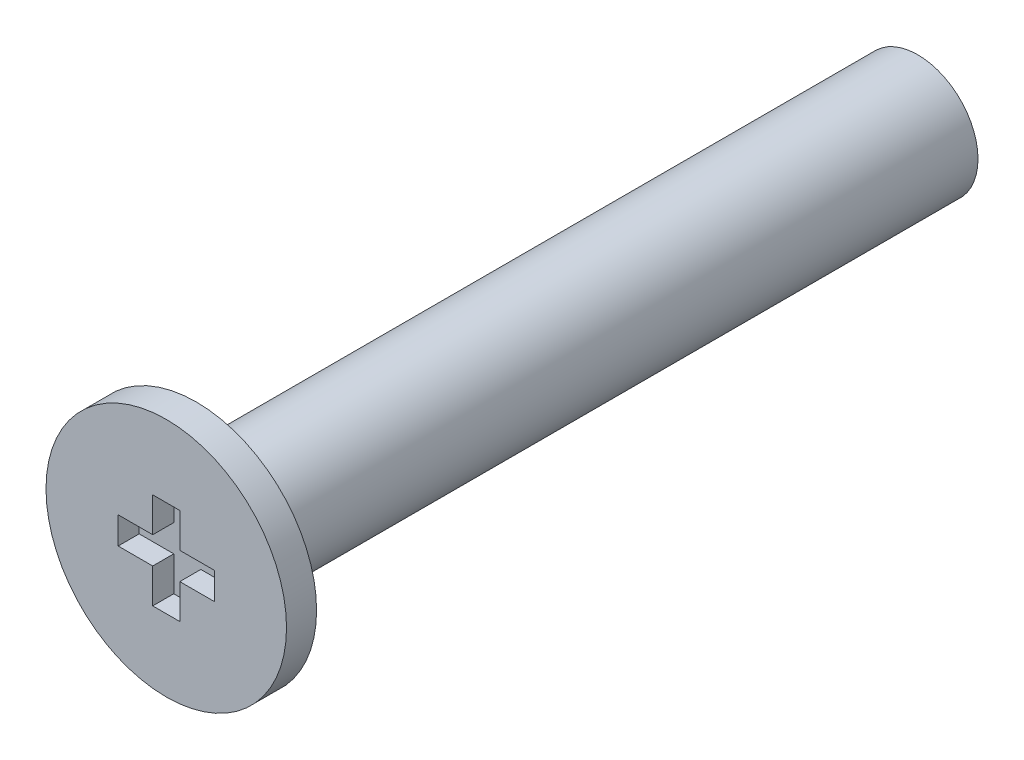
ISO-10303-21;
HEADER;
FILE_DESCRIPTION(('STEP AP214'),'2;1');
FILE_NAME('part.step','',(''),(''),'','','');
FILE_SCHEMA(('AUTOMOTIVE_DESIGN { 1 0 10303 214 1 1 1 1 }'));
ENDSEC;
DATA;
#1=APPLICATION_CONTEXT('core data for automotive mechanical design processes');
#2=APPLICATION_PROTOCOL_DEFINITION('international standard','automotive_design',2000,#1);
#3=PRODUCT_CONTEXT('',#1,'mechanical');
#4=PRODUCT('Part','Part','',(#3));
#5=PRODUCT_RELATED_PRODUCT_CATEGORY('part','',(#4));
#6=PRODUCT_DEFINITION_FORMATION('','',#4);
#7=PRODUCT_DEFINITION_CONTEXT('part definition',#1,'design');
#8=PRODUCT_DEFINITION('design','',#6,#7);
#9=PRODUCT_DEFINITION_SHAPE('','',#8);
#10=(LENGTH_UNIT() NAMED_UNIT(*) SI_UNIT(.MILLI.,.METRE.));
#11=(NAMED_UNIT(*) PLANE_ANGLE_UNIT() SI_UNIT($,.RADIAN.));
#12=(NAMED_UNIT(*) SI_UNIT($,.STERADIAN.) SOLID_ANGLE_UNIT());
#13=UNCERTAINTY_MEASURE_WITH_UNIT(LENGTH_MEASURE(1.E-05),#10,'distance_accuracy_value','');
#14=(GEOMETRIC_REPRESENTATION_CONTEXT(3) GLOBAL_UNCERTAINTY_ASSIGNED_CONTEXT((#13)) GLOBAL_UNIT_ASSIGNED_CONTEXT((#10,
#11,#12)) REPRESENTATION_CONTEXT('',''));
#15=CARTESIAN_POINT('',(0.,0.,0.));
#16=DIRECTION('',(0.,0.,1.));
#17=DIRECTION('',(1.,0.,0.));
#18=AXIS2_PLACEMENT_3D('',#15,#16,#17);
#19=CARTESIAN_POINT('',(0.,0.,-12.));
#20=DIRECTION('',(0.,0.,1.));
#21=DIRECTION('',(1.,0.,0.));
#22=AXIS2_PLACEMENT_3D('',#19,#20,#21);
#23=CYLINDRICAL_SURFACE('',#22,1.);
#24=CARTESIAN_POINT('',(0.,0.,-12.));
#25=DIRECTION('',(0.,0.,1.));
#26=DIRECTION('',(1.,0.,0.));
#27=AXIS2_PLACEMENT_3D('',#24,#25,#26);
#28=CIRCLE('',#27,1.);
#29=CARTESIAN_POINT('',(1.,0.,-12.));
#30=VERTEX_POINT('',#29);
#31=EDGE_CURVE('E212',#30,#30,#28,.T.);
#32=ORIENTED_EDGE('',*,*,#31,.T.);
#33=EDGE_LOOP('',(#32));
#34=FACE_BOUND('',#33,.T.);
#35=CARTESIAN_POINT('',(0.,0.,0.));
#36=DIRECTION('',(0.,0.,1.));
#37=DIRECTION('',(1.,0.,0.));
#38=AXIS2_PLACEMENT_3D('',#35,#36,#37);
#39=CIRCLE('',#38,1.);
#40=CARTESIAN_POINT('',(1.,0.,0.));
#41=VERTEX_POINT('',#40);
#42=EDGE_CURVE('E208',#41,#41,#39,.T.);
#43=ORIENTED_EDGE('',*,*,#42,.F.);
#44=EDGE_LOOP('',(#43));
#45=FACE_BOUND('',#44,.T.);
#46=ADVANCED_FACE('F41',(#34,#45),#23,.T.);
#47=CARTESIAN_POINT('',(0.,0.,-12.));
#48=DIRECTION('',(0.,0.,1.));
#49=DIRECTION('',(1.,0.,0.));
#50=AXIS2_PLACEMENT_3D('',#47,#48,#49);
#51=PLANE('',#50);
#52=ORIENTED_EDGE('',*,*,#31,.F.);
#53=EDGE_LOOP('',(#52));
#54=FACE_BOUND('',#53,.T.);
#55=ADVANCED_FACE('F281',(#54),#51,.F.);
#56=CARTESIAN_POINT('',(0.,0.,0.));
#57=DIRECTION('',(0.,0.,1.));
#58=DIRECTION('',(1.,0.,0.));
#59=AXIS2_PLACEMENT_3D('',#56,#57,#58);
#60=PLANE('',#59);
#61=ORIENTED_EDGE('',*,*,#42,.T.);
#62=EDGE_LOOP('',(#61));
#63=FACE_BOUND('',#62,.T.);
#64=CARTESIAN_POINT('',(0.,0.,0.));
#65=DIRECTION('',(0.,0.,-1.));
#66=DIRECTION('',(-1.,0.,0.));
#67=AXIS2_PLACEMENT_3D('',#64,#65,#66);
#68=CIRCLE('',#67,2.);
#69=CARTESIAN_POINT('',(-2.,0.,0.));
#70=VERTEX_POINT('',#69);
#71=EDGE_CURVE('E210',#70,#70,#68,.T.);
#72=ORIENTED_EDGE('',*,*,#71,.T.);
#73=EDGE_LOOP('',(#72));
#74=FACE_BOUND('',#73,.T.);
#75=ADVANCED_FACE('F286',(#63,#74),#60,.F.);
#76=CARTESIAN_POINT('',(0.,0.,-2.));
#77=DIRECTION('',(0.,0.,-1.));
#78=DIRECTION('',(-1.,0.,0.));
#79=AXIS2_PLACEMENT_3D('',#76,#77,#78);
#80=CYLINDRICAL_SURFACE('',#79,2.);
#81=ORIENTED_EDGE('',*,*,#71,.F.);
#82=EDGE_LOOP('',(#81));
#83=FACE_BOUND('',#82,.T.);
#84=CARTESIAN_POINT('',(0.,0.,0.5));
#85=DIRECTION('',(0.,0.,-1.));
#86=DIRECTION('',(-1.,0.,0.));
#87=AXIS2_PLACEMENT_3D('',#84,#85,#86);
#88=CIRCLE('',#87,2.);
#89=CARTESIAN_POINT('',(-2.,0.,0.5));
#90=VERTEX_POINT('',#89);
#91=EDGE_CURVE('E176',#90,#90,#88,.T.);
#92=ORIENTED_EDGE('',*,*,#91,.T.);
#93=EDGE_LOOP('',(#92));
#94=FACE_BOUND('',#93,.T.);
#95=ADVANCED_FACE('F300',(#83,#94),#80,.T.);
#96=CARTESIAN_POINT('',(2.,0.,0.5));
#97=DIRECTION('',(0.,0.,-1.));
#98=DIRECTION('',(-1.,0.,0.));
#99=AXIS2_PLACEMENT_3D('',#96,#97,#98);
#100=PLANE('',#99);
#101=DIRECTION('',(-1.,0.,0.));
#102=VECTOR('',#101,1.);
#103=CARTESIAN_POINT('',(2.,-0.8,0.5));
#104=LINE('',#103,#102);
#105=CARTESIAN_POINT('',(0.225,-0.8,0.5));
#106=VERTEX_POINT('',#105);
#107=CARTESIAN_POINT('',(-0.225,-0.8,0.5));
#108=VERTEX_POINT('',#107);
#109=EDGE_CURVE('E211',#106,#108,#104,.T.);
#110=ORIENTED_EDGE('',*,*,#109,.T.);
#111=DIRECTION('',(0.,1.,0.));
#112=VECTOR('',#111,1.);
#113=CARTESIAN_POINT('',(-0.225,0.,0.5));
#114=LINE('',#113,#112);
#115=CARTESIAN_POINT('',(-0.225,-0.225,0.5));
#116=VERTEX_POINT('',#115);
#117=EDGE_CURVE('E11',#108,#116,#114,.T.);
#118=ORIENTED_EDGE('',*,*,#117,.T.);
#119=DIRECTION('',(-1.,0.,0.));
#120=VECTOR('',#119,1.);
#121=CARTESIAN_POINT('',(2.,-0.225,0.5));
#122=LINE('',#121,#120);
#123=CARTESIAN_POINT('',(-0.8,-0.225,0.5));
#124=VERTEX_POINT('',#123);
#125=EDGE_CURVE('E48',#116,#124,#122,.T.);
#126=ORIENTED_EDGE('',*,*,#125,.T.);
#127=DIRECTION('',(0.,1.,0.));
#128=VECTOR('',#127,1.);
#129=CARTESIAN_POINT('',(-0.8,0.,0.5));
#130=LINE('',#129,#128);
#131=CARTESIAN_POINT('',(-0.8,0.225,0.5));
#132=VERTEX_POINT('',#131);
#133=EDGE_CURVE('E244',#124,#132,#130,.T.);
#134=ORIENTED_EDGE('',*,*,#133,.T.);
#135=DIRECTION('',(1.,0.,0.));
#136=VECTOR('',#135,1.);
#137=CARTESIAN_POINT('',(2.,0.225,0.5));
#138=LINE('',#137,#136);
#139=CARTESIAN_POINT('',(-0.225,0.225,0.5));
#140=VERTEX_POINT('',#139);
#141=EDGE_CURVE('E236',#132,#140,#138,.T.);
#142=ORIENTED_EDGE('',*,*,#141,.T.);
#143=DIRECTION('',(0.,1.,0.));
#144=VECTOR('',#143,1.);
#145=CARTESIAN_POINT('',(-0.225,0.,0.5));
#146=LINE('',#145,#144);
#147=CARTESIAN_POINT('',(-0.225,0.8,0.5));
#148=VERTEX_POINT('',#147);
#149=EDGE_CURVE('E237',#140,#148,#146,.T.);
#150=ORIENTED_EDGE('',*,*,#149,.T.);
#151=DIRECTION('',(1.,0.,0.));
#152=VECTOR('',#151,1.);
#153=CARTESIAN_POINT('',(2.,0.8,0.5));
#154=LINE('',#153,#152);
#155=CARTESIAN_POINT('',(0.225,0.8,0.5));
#156=VERTEX_POINT('',#155);
#157=EDGE_CURVE('E231',#148,#156,#154,.T.);
#158=ORIENTED_EDGE('',*,*,#157,.T.);
#159=DIRECTION('',(0.,-1.,0.));
#160=VECTOR('',#159,1.);
#161=CARTESIAN_POINT('',(0.225,0.,0.5));
#162=LINE('',#161,#160);
#163=CARTESIAN_POINT('',(0.225,0.225,0.5));
#164=VERTEX_POINT('',#163);
#165=EDGE_CURVE('E227',#156,#164,#162,.T.);
#166=ORIENTED_EDGE('',*,*,#165,.T.);
#167=DIRECTION('',(1.,0.,0.));
#168=VECTOR('',#167,1.);
#169=CARTESIAN_POINT('',(2.,0.225,0.5));
#170=LINE('',#169,#168);
#171=CARTESIAN_POINT('',(0.8,0.225,0.5));
#172=VERTEX_POINT('',#171);
#173=EDGE_CURVE('E226',#164,#172,#170,.T.);
#174=ORIENTED_EDGE('',*,*,#173,.T.);
#175=DIRECTION('',(0.,-1.,0.));
#176=VECTOR('',#175,1.);
#177=CARTESIAN_POINT('',(0.8,0.,0.5));
#178=LINE('',#177,#176);
#179=CARTESIAN_POINT('',(0.8,-0.225,0.5));
#180=VERTEX_POINT('',#179);
#181=EDGE_CURVE('E221',#172,#180,#178,.T.);
#182=ORIENTED_EDGE('',*,*,#181,.T.);
#183=DIRECTION('',(-1.,0.,0.));
#184=VECTOR('',#183,1.);
#185=CARTESIAN_POINT('',(2.,-0.225,0.5));
#186=LINE('',#185,#184);
#187=CARTESIAN_POINT('',(0.225,-0.225,0.5));
#188=VERTEX_POINT('',#187);
#189=EDGE_CURVE('E222',#180,#188,#186,.T.);
#190=ORIENTED_EDGE('',*,*,#189,.T.);
#191=DIRECTION('',(0.,-1.,0.));
#192=VECTOR('',#191,1.);
#193=CARTESIAN_POINT('',(0.225,0.,0.5));
#194=LINE('',#193,#192);
#195=EDGE_CURVE('E217',#188,#106,#194,.T.);
#196=ORIENTED_EDGE('',*,*,#195,.T.);
#197=EDGE_LOOP('',(#110,#118,#126,#134,#142,#150,#158,#166,#174,#182,#190,#196));
#198=FACE_BOUND('',#197,.T.);
#199=ORIENTED_EDGE('',*,*,#91,.F.);
#200=EDGE_LOOP('',(#199));
#201=FACE_BOUND('',#200,.T.);
#202=ADVANCED_FACE('F241',(#198,#201),#100,.F.);
#203=CARTESIAN_POINT('',(-0.225,-0.225,0.15));
#204=DIRECTION('',(-1.,0.,0.));
#205=DIRECTION('',(0.,0.,1.));
#206=AXIS2_PLACEMENT_3D('',#203,#204,#205);
#207=PLANE('',#206);
#208=DIRECTION('',(0.,0.,1.));
#209=VECTOR('',#208,1.);
#210=CARTESIAN_POINT('',(-0.225,-0.8,0.15));
#211=LINE('',#210,#209);
#212=CARTESIAN_POINT('',(-0.225,-0.8,0.15));
#213=VERTEX_POINT('',#212);
#214=EDGE_CURVE('E54',#213,#108,#211,.T.);
#215=ORIENTED_EDGE('',*,*,#214,.F.);
#216=DIRECTION('',(0.,-1.,0.));
#217=VECTOR('',#216,1.);
#218=CARTESIAN_POINT('',(-0.225,-0.225,0.15));
#219=LINE('',#218,#217);
#220=CARTESIAN_POINT('',(-0.225,-0.225,0.15));
#221=VERTEX_POINT('',#220);
#222=EDGE_CURVE('E129',#221,#213,#219,.T.);
#223=ORIENTED_EDGE('',*,*,#222,.F.);
#224=DIRECTION('',(0.,0.,1.));
#225=VECTOR('',#224,1.);
#226=CARTESIAN_POINT('',(-0.225,-0.225,0.15));
#227=LINE('',#226,#225);
#228=EDGE_CURVE('E173',#221,#116,#227,.T.);
#229=ORIENTED_EDGE('',*,*,#228,.T.);
#230=ORIENTED_EDGE('',*,*,#117,.F.);
#231=EDGE_LOOP('',(#215,#223,#229,#230));
#232=FACE_BOUND('',#231,.T.);
#233=ADVANCED_FACE('F127',(#232),#207,.F.);
#234=CARTESIAN_POINT('',(-0.8,-0.225,0.15));
#235=DIRECTION('',(0.,-1.,0.));
#236=DIRECTION('',(0.,0.,-1.));
#237=AXIS2_PLACEMENT_3D('',#234,#235,#236);
#238=PLANE('',#237);
#239=ORIENTED_EDGE('',*,*,#228,.F.);
#240=DIRECTION('',(1.,0.,0.));
#241=VECTOR('',#240,1.);
#242=CARTESIAN_POINT('',(-0.8,-0.225,0.15));
#243=LINE('',#242,#241);
#244=CARTESIAN_POINT('',(-0.8,-0.225,0.15));
#245=VERTEX_POINT('',#244);
#246=EDGE_CURVE('E131',#245,#221,#243,.T.);
#247=ORIENTED_EDGE('',*,*,#246,.F.);
#248=DIRECTION('',(0.,0.,1.));
#249=VECTOR('',#248,1.);
#250=CARTESIAN_POINT('',(-0.8,-0.225,0.15));
#251=LINE('',#250,#249);
#252=EDGE_CURVE('E180',#245,#124,#251,.T.);
#253=ORIENTED_EDGE('',*,*,#252,.T.);
#254=ORIENTED_EDGE('',*,*,#125,.F.);
#255=EDGE_LOOP('',(#239,#247,#253,#254));
#256=FACE_BOUND('',#255,.T.);
#257=ADVANCED_FACE('F273',(#256),#238,.F.);
#258=CARTESIAN_POINT('',(-0.8,0.225,0.15));
#259=DIRECTION('',(-1.,0.,0.));
#260=DIRECTION('',(0.,0.,1.));
#261=AXIS2_PLACEMENT_3D('',#258,#259,#260);
#262=PLANE('',#261);
#263=ORIENTED_EDGE('',*,*,#252,.F.);
#264=DIRECTION('',(0.,-1.,0.));
#265=VECTOR('',#264,1.);
#266=CARTESIAN_POINT('',(-0.8,0.225,0.15));
#267=LINE('',#266,#265);
#268=CARTESIAN_POINT('',(-0.8,0.225,0.15));
#269=VERTEX_POINT('',#268);
#270=EDGE_CURVE('E175',#269,#245,#267,.T.);
#271=ORIENTED_EDGE('',*,*,#270,.F.);
#272=DIRECTION('',(0.,0.,1.));
#273=VECTOR('',#272,1.);
#274=CARTESIAN_POINT('',(-0.8,0.225,0.15));
#275=LINE('',#274,#273);
#276=EDGE_CURVE('E177',#269,#132,#275,.T.);
#277=ORIENTED_EDGE('',*,*,#276,.T.);
#278=ORIENTED_EDGE('',*,*,#133,.F.);
#279=EDGE_LOOP('',(#263,#271,#277,#278));
#280=FACE_BOUND('',#279,.T.);
#281=ADVANCED_FACE('F275',(#280),#262,.F.);
#282=CARTESIAN_POINT('',(-0.225,0.225,0.15));
#283=DIRECTION('',(0.,1.,0.));
#284=DIRECTION('',(0.,0.,1.));
#285=AXIS2_PLACEMENT_3D('',#282,#283,#284);
#286=PLANE('',#285);
#287=ORIENTED_EDGE('',*,*,#276,.F.);
#288=DIRECTION('',(-1.,0.,0.));
#289=VECTOR('',#288,1.);
#290=CARTESIAN_POINT('',(-0.225,0.225,0.15));
#291=LINE('',#290,#289);
#292=CARTESIAN_POINT('',(-0.225,0.225,0.15));
#293=VERTEX_POINT('',#292);
#294=EDGE_CURVE('E170',#293,#269,#291,.T.);
#295=ORIENTED_EDGE('',*,*,#294,.F.);
#296=DIRECTION('',(0.,0.,1.));
#297=VECTOR('',#296,1.);
#298=CARTESIAN_POINT('',(-0.225,0.225,0.15));
#299=LINE('',#298,#297);
#300=EDGE_CURVE('E181',#293,#140,#299,.T.);
#301=ORIENTED_EDGE('',*,*,#300,.T.);
#302=ORIENTED_EDGE('',*,*,#141,.F.);
#303=EDGE_LOOP('',(#287,#295,#301,#302));
#304=FACE_BOUND('',#303,.T.);
#305=ADVANCED_FACE('F269',(#304),#286,.F.);
#306=CARTESIAN_POINT('',(-0.225,0.8,0.15));
#307=DIRECTION('',(-1.,0.,0.));
#308=DIRECTION('',(0.,0.,1.));
#309=AXIS2_PLACEMENT_3D('',#306,#307,#308);
#310=PLANE('',#309);
#311=ORIENTED_EDGE('',*,*,#300,.F.);
#312=DIRECTION('',(0.,-1.,0.));
#313=VECTOR('',#312,1.);
#314=CARTESIAN_POINT('',(-0.225,0.8,0.15));
#315=LINE('',#314,#313);
#316=CARTESIAN_POINT('',(-0.225,0.8,0.15));
#317=VERTEX_POINT('',#316);
#318=EDGE_CURVE('E168',#317,#293,#315,.T.);
#319=ORIENTED_EDGE('',*,*,#318,.F.);
#320=DIRECTION('',(0.,0.,1.));
#321=VECTOR('',#320,1.);
#322=CARTESIAN_POINT('',(-0.225,0.8,0.15));
#323=LINE('',#322,#321);
#324=EDGE_CURVE('E188',#317,#148,#323,.T.);
#325=ORIENTED_EDGE('',*,*,#324,.T.);
#326=ORIENTED_EDGE('',*,*,#149,.F.);
#327=EDGE_LOOP('',(#311,#319,#325,#326));
#328=FACE_BOUND('',#327,.T.);
#329=ADVANCED_FACE('F266',(#328),#310,.F.);
#330=CARTESIAN_POINT('',(0.225,0.8,0.15));
#331=DIRECTION('',(0.,1.,0.));
#332=DIRECTION('',(0.,0.,1.));
#333=AXIS2_PLACEMENT_3D('',#330,#331,#332);
#334=PLANE('',#333);
#335=ORIENTED_EDGE('',*,*,#324,.F.);
#336=DIRECTION('',(-1.,0.,0.));
#337=VECTOR('',#336,1.);
#338=CARTESIAN_POINT('',(0.225,0.8,0.15));
#339=LINE('',#338,#337);
#340=CARTESIAN_POINT('',(0.225,0.8,0.15));
#341=VERTEX_POINT('',#340);
#342=EDGE_CURVE('E164',#341,#317,#339,.T.);
#343=ORIENTED_EDGE('',*,*,#342,.F.);
#344=DIRECTION('',(0.,0.,1.));
#345=VECTOR('',#344,1.);
#346=CARTESIAN_POINT('',(0.225,0.8,0.15));
#347=LINE('',#346,#345);
#348=EDGE_CURVE('E189',#341,#156,#347,.T.);
#349=ORIENTED_EDGE('',*,*,#348,.T.);
#350=ORIENTED_EDGE('',*,*,#157,.F.);
#351=EDGE_LOOP('',(#335,#343,#349,#350));
#352=FACE_BOUND('',#351,.T.);
#353=ADVANCED_FACE('F261',(#352),#334,.F.);
#354=CARTESIAN_POINT('',(0.225,0.225,0.15));
#355=DIRECTION('',(1.,0.,0.));
#356=DIRECTION('',(0.,0.,-1.));
#357=AXIS2_PLACEMENT_3D('',#354,#355,#356);
#358=PLANE('',#357);
#359=ORIENTED_EDGE('',*,*,#348,.F.);
#360=DIRECTION('',(0.,1.,0.));
#361=VECTOR('',#360,1.);
#362=CARTESIAN_POINT('',(0.225,0.225,0.15));
#363=LINE('',#362,#361);
#364=CARTESIAN_POINT('',(0.225,0.225,0.15));
#365=VERTEX_POINT('',#364);
#366=EDGE_CURVE('E158',#365,#341,#363,.T.);
#367=ORIENTED_EDGE('',*,*,#366,.F.);
#368=DIRECTION('',(0.,0.,1.));
#369=VECTOR('',#368,1.);
#370=CARTESIAN_POINT('',(0.225,0.225,0.15));
#371=LINE('',#370,#369);
#372=EDGE_CURVE('E195',#365,#164,#371,.T.);
#373=ORIENTED_EDGE('',*,*,#372,.T.);
#374=ORIENTED_EDGE('',*,*,#165,.F.);
#375=EDGE_LOOP('',(#359,#367,#373,#374));
#376=FACE_BOUND('',#375,.T.);
#377=ADVANCED_FACE('F263',(#376),#358,.F.);
#378=CARTESIAN_POINT('',(0.8,0.225,0.15));
#379=DIRECTION('',(0.,1.,0.));
#380=DIRECTION('',(0.,0.,1.));
#381=AXIS2_PLACEMENT_3D('',#378,#379,#380);
#382=PLANE('',#381);
#383=ORIENTED_EDGE('',*,*,#372,.F.);
#384=DIRECTION('',(-1.,0.,0.));
#385=VECTOR('',#384,1.);
#386=CARTESIAN_POINT('',(0.8,0.225,0.15));
#387=LINE('',#386,#385);
#388=CARTESIAN_POINT('',(0.8,0.225,0.15));
#389=VERTEX_POINT('',#388);
#390=EDGE_CURVE('E160',#389,#365,#387,.T.);
#391=ORIENTED_EDGE('',*,*,#390,.F.);
#392=DIRECTION('',(0.,0.,1.));
#393=VECTOR('',#392,1.);
#394=CARTESIAN_POINT('',(0.8,0.225,0.15));
#395=LINE('',#394,#393);
#396=EDGE_CURVE('E194',#389,#172,#395,.T.);
#397=ORIENTED_EDGE('',*,*,#396,.T.);
#398=ORIENTED_EDGE('',*,*,#173,.F.);
#399=EDGE_LOOP('',(#383,#391,#397,#398));
#400=FACE_BOUND('',#399,.T.);
#401=ADVANCED_FACE('F257',(#400),#382,.F.);
#402=CARTESIAN_POINT('',(0.8,-0.225,0.15));
#403=DIRECTION('',(1.,0.,0.));
#404=DIRECTION('',(0.,0.,-1.));
#405=AXIS2_PLACEMENT_3D('',#402,#403,#404);
#406=PLANE('',#405);
#407=ORIENTED_EDGE('',*,*,#396,.F.);
#408=DIRECTION('',(0.,1.,0.));
#409=VECTOR('',#408,1.);
#410=CARTESIAN_POINT('',(0.8,-0.225,0.15));
#411=LINE('',#410,#409);
#412=CARTESIAN_POINT('',(0.8,-0.225,0.15));
#413=VERTEX_POINT('',#412);
#414=EDGE_CURVE('E153',#413,#389,#411,.T.);
#415=ORIENTED_EDGE('',*,*,#414,.F.);
#416=DIRECTION('',(0.,0.,1.));
#417=VECTOR('',#416,1.);
#418=CARTESIAN_POINT('',(0.8,-0.225,0.15));
#419=LINE('',#418,#417);
#420=EDGE_CURVE('E198',#413,#180,#419,.T.);
#421=ORIENTED_EDGE('',*,*,#420,.T.);
#422=ORIENTED_EDGE('',*,*,#181,.F.);
#423=EDGE_LOOP('',(#407,#415,#421,#422));
#424=FACE_BOUND('',#423,.T.);
#425=ADVANCED_FACE('F253',(#424),#406,.F.);
#426=CARTESIAN_POINT('',(0.225,-0.225,0.15));
#427=DIRECTION('',(0.,-1.,0.));
#428=DIRECTION('',(0.,0.,-1.));
#429=AXIS2_PLACEMENT_3D('',#426,#427,#428);
#430=PLANE('',#429);
#431=ORIENTED_EDGE('',*,*,#420,.F.);
#432=DIRECTION('',(1.,0.,0.));
#433=VECTOR('',#432,1.);
#434=CARTESIAN_POINT('',(0.225,-0.225,0.15));
#435=LINE('',#434,#433);
#436=CARTESIAN_POINT('',(0.225,-0.225,0.15));
#437=VERTEX_POINT('',#436);
#438=EDGE_CURVE('E154',#437,#413,#435,.T.);
#439=ORIENTED_EDGE('',*,*,#438,.F.);
#440=DIRECTION('',(0.,0.,1.));
#441=VECTOR('',#440,1.);
#442=CARTESIAN_POINT('',(0.225,-0.225,0.15));
#443=LINE('',#442,#441);
#444=EDGE_CURVE('E201',#437,#188,#443,.T.);
#445=ORIENTED_EDGE('',*,*,#444,.T.);
#446=ORIENTED_EDGE('',*,*,#189,.F.);
#447=EDGE_LOOP('',(#431,#439,#445,#446));
#448=FACE_BOUND('',#447,.T.);
#449=ADVANCED_FACE('F251',(#448),#430,.F.);
#450=CARTESIAN_POINT('',(0.225,-0.8,0.15));
#451=DIRECTION('',(1.,0.,0.));
#452=DIRECTION('',(0.,0.,-1.));
#453=AXIS2_PLACEMENT_3D('',#450,#451,#452);
#454=PLANE('',#453);
#455=ORIENTED_EDGE('',*,*,#444,.F.);
#456=DIRECTION('',(0.,1.,0.));
#457=VECTOR('',#456,1.);
#458=CARTESIAN_POINT('',(0.225,-0.8,0.15));
#459=LINE('',#458,#457);
#460=CARTESIAN_POINT('',(0.225,-0.8,0.15));
#461=VERTEX_POINT('',#460);
#462=EDGE_CURVE('E142',#461,#437,#459,.T.);
#463=ORIENTED_EDGE('',*,*,#462,.F.);
#464=DIRECTION('',(0.,0.,1.));
#465=VECTOR('',#464,1.);
#466=CARTESIAN_POINT('',(0.225,-0.8,0.15));
#467=LINE('',#466,#465);
#468=EDGE_CURVE('E134',#461,#106,#467,.T.);
#469=ORIENTED_EDGE('',*,*,#468,.T.);
#470=ORIENTED_EDGE('',*,*,#195,.F.);
#471=EDGE_LOOP('',(#455,#463,#469,#470));
#472=FACE_BOUND('',#471,.T.);
#473=ADVANCED_FACE('F249',(#472),#454,.F.);
#474=CARTESIAN_POINT('',(-0.225,-0.8,0.15));
#475=DIRECTION('',(0.,-1.,0.));
#476=DIRECTION('',(0.,0.,-1.));
#477=AXIS2_PLACEMENT_3D('',#474,#475,#476);
#478=PLANE('',#477);
#479=ORIENTED_EDGE('',*,*,#468,.F.);
#480=DIRECTION('',(1.,0.,0.));
#481=VECTOR('',#480,1.);
#482=CARTESIAN_POINT('',(-0.225,-0.8,0.15));
#483=LINE('',#482,#481);
#484=EDGE_CURVE('E140',#213,#461,#483,.T.);
#485=ORIENTED_EDGE('',*,*,#484,.F.);
#486=ORIENTED_EDGE('',*,*,#214,.T.);
#487=ORIENTED_EDGE('',*,*,#109,.F.);
#488=EDGE_LOOP('',(#479,#485,#486,#487));
#489=FACE_BOUND('',#488,.T.);
#490=ADVANCED_FACE('F139',(#489),#478,.F.);
#491=CARTESIAN_POINT('',(0.,0.,0.15));
#492=DIRECTION('',(0.,0.,1.));
#493=DIRECTION('',(1.,0.,0.));
#494=AXIS2_PLACEMENT_3D('',#491,#492,#493);
#495=PLANE('',#494);
#496=ORIENTED_EDGE('',*,*,#222,.T.);
#497=ORIENTED_EDGE('',*,*,#484,.T.);
#498=ORIENTED_EDGE('',*,*,#462,.T.);
#499=ORIENTED_EDGE('',*,*,#438,.T.);
#500=ORIENTED_EDGE('',*,*,#414,.T.);
#501=ORIENTED_EDGE('',*,*,#390,.T.);
#502=ORIENTED_EDGE('',*,*,#366,.T.);
#503=ORIENTED_EDGE('',*,*,#342,.T.);
#504=ORIENTED_EDGE('',*,*,#318,.T.);
#505=ORIENTED_EDGE('',*,*,#294,.T.);
#506=ORIENTED_EDGE('',*,*,#270,.T.);
#507=ORIENTED_EDGE('',*,*,#246,.T.);
#508=EDGE_LOOP('',(#496,#497,#498,#499,#500,#501,#502,#503,#504,#505,#506,#507));
#509=FACE_BOUND('',#508,.T.);
#510=ADVANCED_FACE('F141',(#509),#495,.T.);
#511=CLOSED_SHELL('',(#46,#55,#75,#95,#202,#233,#257,#281,#305,#329,#353,#377,#401,#425,#449,
#473,#490,#510));
#512=MANIFOLD_SOLID_BREP('B2',#511);
#513=ADVANCED_BREP_SHAPE_REPRESENTATION('',(#18,#512),#14);
#514=SHAPE_DEFINITION_REPRESENTATION(#9,#513);
ENDSEC;
END-ISO-10303-21;
